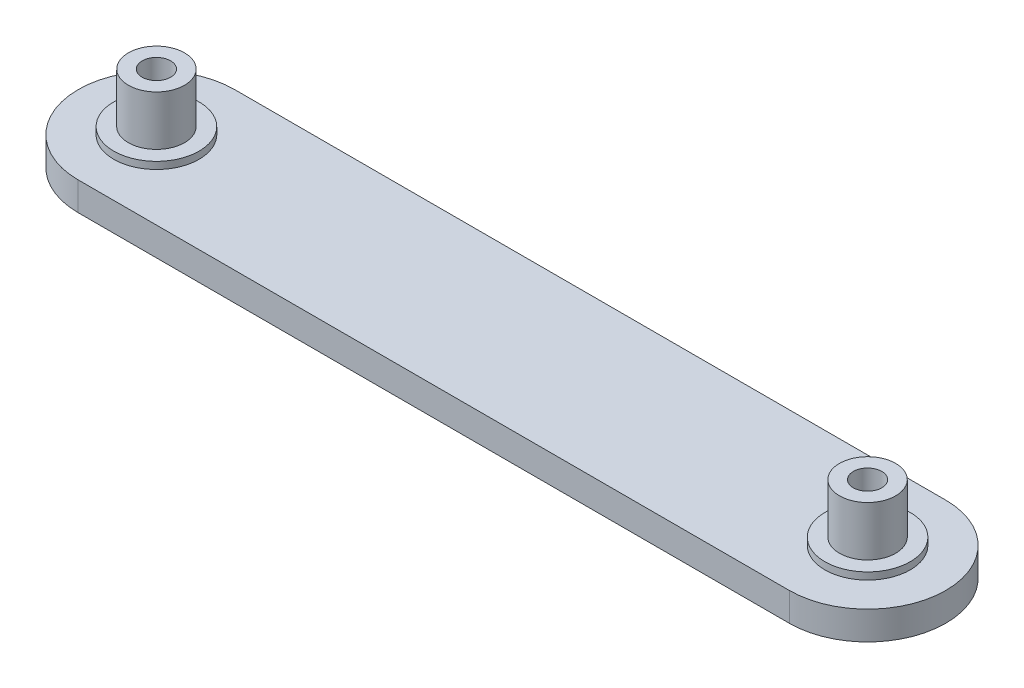
ISO-10303-21;
HEADER;
FILE_DESCRIPTION(('STEP AP214'),'2;1');
FILE_NAME('part.step','',(''),(''),'','','');
FILE_SCHEMA(('AUTOMOTIVE_DESIGN { 1 0 10303 214 1 1 1 1 }'));
ENDSEC;
DATA;
#1=APPLICATION_CONTEXT('core data for automotive mechanical design processes');
#2=APPLICATION_PROTOCOL_DEFINITION('international standard','automotive_design',2000,#1);
#3=PRODUCT_CONTEXT('',#1,'mechanical');
#4=PRODUCT('Part','Part','',(#3));
#5=PRODUCT_RELATED_PRODUCT_CATEGORY('part','',(#4));
#6=PRODUCT_DEFINITION_FORMATION('','',#4);
#7=PRODUCT_DEFINITION_CONTEXT('part definition',#1,'design');
#8=PRODUCT_DEFINITION('design','',#6,#7);
#9=PRODUCT_DEFINITION_SHAPE('','',#8);
#10=(LENGTH_UNIT() NAMED_UNIT(*) SI_UNIT(.MILLI.,.METRE.));
#11=(NAMED_UNIT(*) PLANE_ANGLE_UNIT() SI_UNIT($,.RADIAN.));
#12=(NAMED_UNIT(*) SI_UNIT($,.STERADIAN.) SOLID_ANGLE_UNIT());
#13=UNCERTAINTY_MEASURE_WITH_UNIT(LENGTH_MEASURE(1.E-05),#10,'distance_accuracy_value','');
#14=(GEOMETRIC_REPRESENTATION_CONTEXT(3) GLOBAL_UNCERTAINTY_ASSIGNED_CONTEXT((#13)) GLOBAL_UNIT_ASSIGNED_CONTEXT((#10,
#11,#12)) REPRESENTATION_CONTEXT('',''));
#15=CARTESIAN_POINT('',(0.,0.,0.));
#16=DIRECTION('',(0.,0.,1.));
#17=DIRECTION('',(1.,0.,0.));
#18=AXIS2_PLACEMENT_3D('',#15,#16,#17);
#19=CARTESIAN_POINT('',(0.,4.,0.));
#20=DIRECTION('',(0.,-1.,0.));
#21=DIRECTION('',(0.,0.,-1.));
#22=AXIS2_PLACEMENT_3D('',#19,#20,#21);
#23=CYLINDRICAL_SURFACE('',#22,11.);
#24=CARTESIAN_POINT('',(0.,0.,0.));
#25=DIRECTION('',(0.,1.,0.));
#26=DIRECTION('',(0.,0.,1.));
#27=AXIS2_PLACEMENT_3D('',#24,#25,#26);
#28=CIRCLE('',#27,11.);
#29=CARTESIAN_POINT('',(0.,0.,-11.));
#30=VERTEX_POINT('',#29);
#31=CARTESIAN_POINT('',(0.,0.,11.));
#32=VERTEX_POINT('',#31);
#33=EDGE_CURVE('E100',#30,#32,#28,.T.);
#34=ORIENTED_EDGE('',*,*,#33,.T.);
#35=DIRECTION('',(0.,-1.,0.));
#36=VECTOR('',#35,1.);
#37=CARTESIAN_POINT('',(0.,4.,11.));
#38=LINE('',#37,#36);
#39=CARTESIAN_POINT('',(0.,4.,11.));
#40=VERTEX_POINT('',#39);
#41=EDGE_CURVE('E36',#40,#32,#38,.T.);
#42=ORIENTED_EDGE('',*,*,#41,.F.);
#43=CARTESIAN_POINT('',(0.,4.,0.));
#44=DIRECTION('',(0.,1.,0.));
#45=DIRECTION('',(0.,0.,1.));
#46=AXIS2_PLACEMENT_3D('',#43,#44,#45);
#47=CIRCLE('',#46,11.);
#48=CARTESIAN_POINT('',(0.,4.,-11.));
#49=VERTEX_POINT('',#48);
#50=EDGE_CURVE('E87',#49,#40,#47,.T.);
#51=ORIENTED_EDGE('',*,*,#50,.F.);
#52=DIRECTION('',(0.,-1.,0.));
#53=VECTOR('',#52,1.);
#54=CARTESIAN_POINT('',(0.,4.,-11.));
#55=LINE('',#54,#53);
#56=EDGE_CURVE('E96',#49,#30,#55,.T.);
#57=ORIENTED_EDGE('',*,*,#56,.T.);
#58=EDGE_LOOP('',(#34,#42,#51,#57));
#59=FACE_BOUND('',#58,.T.);
#60=ADVANCED_FACE('F33',(#59),#23,.T.);
#61=CARTESIAN_POINT('',(0.,4.,11.));
#62=DIRECTION('',(0.,0.,-1.));
#63=DIRECTION('',(-1.,0.,0.));
#64=AXIS2_PLACEMENT_3D('',#61,#62,#63);
#65=PLANE('',#64);
#66=DIRECTION('',(1.,0.,0.));
#67=VECTOR('',#66,1.);
#68=CARTESIAN_POINT('',(0.,0.,11.));
#69=LINE('',#68,#67);
#70=CARTESIAN_POINT('',(100.,0.,11.));
#71=VERTEX_POINT('',#70);
#72=EDGE_CURVE('E92',#32,#71,#69,.T.);
#73=ORIENTED_EDGE('',*,*,#72,.T.);
#74=DIRECTION('',(0.,-1.,0.));
#75=VECTOR('',#74,1.);
#76=CARTESIAN_POINT('',(100.,4.,11.));
#77=LINE('',#76,#75);
#78=CARTESIAN_POINT('',(100.,4.,11.));
#79=VERTEX_POINT('',#78);
#80=EDGE_CURVE('E90',#79,#71,#77,.T.);
#81=ORIENTED_EDGE('',*,*,#80,.F.);
#82=DIRECTION('',(1.,0.,0.));
#83=VECTOR('',#82,1.);
#84=CARTESIAN_POINT('',(0.,4.,11.));
#85=LINE('',#84,#83);
#86=EDGE_CURVE('E82',#40,#79,#85,.T.);
#87=ORIENTED_EDGE('',*,*,#86,.F.);
#88=ORIENTED_EDGE('',*,*,#41,.T.);
#89=EDGE_LOOP('',(#73,#81,#87,#88));
#90=FACE_BOUND('',#89,.T.);
#91=ADVANCED_FACE('F91',(#90),#65,.F.);
#92=CARTESIAN_POINT('',(100.,4.,0.));
#93=DIRECTION('',(0.,-1.,0.));
#94=DIRECTION('',(0.,0.,-1.));
#95=AXIS2_PLACEMENT_3D('',#92,#93,#94);
#96=CYLINDRICAL_SURFACE('',#95,11.);
#97=CARTESIAN_POINT('',(100.,0.,0.));
#98=DIRECTION('',(0.,1.,0.));
#99=DIRECTION('',(0.,0.,1.));
#100=AXIS2_PLACEMENT_3D('',#97,#98,#99);
#101=CIRCLE('',#100,11.);
#102=CARTESIAN_POINT('',(100.,0.,-11.));
#103=VERTEX_POINT('',#102);
#104=EDGE_CURVE('E68',#71,#103,#101,.T.);
#105=ORIENTED_EDGE('',*,*,#104,.T.);
#106=DIRECTION('',(0.,-1.,0.));
#107=VECTOR('',#106,1.);
#108=CARTESIAN_POINT('',(100.,4.,-11.));
#109=LINE('',#108,#107);
#110=CARTESIAN_POINT('',(100.,4.,-11.));
#111=VERTEX_POINT('',#110);
#112=EDGE_CURVE('E93',#111,#103,#109,.T.);
#113=ORIENTED_EDGE('',*,*,#112,.F.);
#114=CARTESIAN_POINT('',(100.,4.,0.));
#115=DIRECTION('',(0.,1.,0.));
#116=DIRECTION('',(0.,0.,1.));
#117=AXIS2_PLACEMENT_3D('',#114,#115,#116);
#118=CIRCLE('',#117,11.);
#119=EDGE_CURVE('E85',#79,#111,#118,.T.);
#120=ORIENTED_EDGE('',*,*,#119,.F.);
#121=ORIENTED_EDGE('',*,*,#80,.T.);
#122=EDGE_LOOP('',(#105,#113,#120,#121));
#123=FACE_BOUND('',#122,.T.);
#124=ADVANCED_FACE('F94',(#123),#96,.T.);
#125=CARTESIAN_POINT('',(0.,4.,-11.));
#126=DIRECTION('',(0.,0.,1.));
#127=DIRECTION('',(1.,0.,0.));
#128=AXIS2_PLACEMENT_3D('',#125,#126,#127);
#129=PLANE('',#128);
#130=DIRECTION('',(-1.,0.,0.));
#131=VECTOR('',#130,1.);
#132=CARTESIAN_POINT('',(0.,0.,-11.));
#133=LINE('',#132,#131);
#134=EDGE_CURVE('E74',#103,#30,#133,.T.);
#135=ORIENTED_EDGE('',*,*,#134,.T.);
#136=ORIENTED_EDGE('',*,*,#56,.F.);
#137=DIRECTION('',(-1.,0.,0.));
#138=VECTOR('',#137,1.);
#139=CARTESIAN_POINT('',(0.,4.,-11.));
#140=LINE('',#139,#138);
#141=EDGE_CURVE('E51',#111,#49,#140,.T.);
#142=ORIENTED_EDGE('',*,*,#141,.F.);
#143=ORIENTED_EDGE('',*,*,#112,.T.);
#144=EDGE_LOOP('',(#135,#136,#142,#143));
#145=FACE_BOUND('',#144,.T.);
#146=ADVANCED_FACE('F108',(#145),#129,.F.);
#147=CARTESIAN_POINT('',(0.,4.,0.));
#148=DIRECTION('',(0.,1.,0.));
#149=DIRECTION('',(0.,0.,1.));
#150=AXIS2_PLACEMENT_3D('',#147,#148,#149);
#151=PLANE('',#150);
#152=CARTESIAN_POINT('',(100.,4.,0.));
#153=DIRECTION('',(0.,1.,0.));
#154=DIRECTION('',(0.,0.,1.));
#155=AXIS2_PLACEMENT_3D('',#152,#153,#154);
#156=CIRCLE('',#155,6.);
#157=CARTESIAN_POINT('',(100.,4.,6.));
#158=VERTEX_POINT('',#157);
#159=EDGE_CURVE('E120',#158,#158,#156,.T.);
#160=ORIENTED_EDGE('',*,*,#159,.F.);
#161=EDGE_LOOP('',(#160));
#162=FACE_BOUND('',#161,.T.);
#163=CARTESIAN_POINT('',(0.,4.,0.));
#164=DIRECTION('',(0.,1.,0.));
#165=DIRECTION('',(0.,0.,1.));
#166=AXIS2_PLACEMENT_3D('',#163,#164,#165);
#167=CIRCLE('',#166,6.);
#168=CARTESIAN_POINT('',(0.,4.,6.));
#169=VERTEX_POINT('',#168);
#170=EDGE_CURVE('E114',#169,#169,#167,.T.);
#171=ORIENTED_EDGE('',*,*,#170,.F.);
#172=EDGE_LOOP('',(#171));
#173=FACE_BOUND('',#172,.T.);
#174=ORIENTED_EDGE('',*,*,#50,.T.);
#175=ORIENTED_EDGE('',*,*,#86,.T.);
#176=ORIENTED_EDGE('',*,*,#119,.T.);
#177=ORIENTED_EDGE('',*,*,#141,.T.);
#178=EDGE_LOOP('',(#174,#175,#176,#177));
#179=FACE_BOUND('',#178,.T.);
#180=ADVANCED_FACE('F83',(#162,#173,#179),#151,.T.);
#181=CARTESIAN_POINT('',(0.,0.,0.));
#182=DIRECTION('',(0.,1.,0.));
#183=DIRECTION('',(0.,0.,1.));
#184=AXIS2_PLACEMENT_3D('',#181,#182,#183);
#185=PLANE('',#184);
#186=CARTESIAN_POINT('',(0.,0.,0.));
#187=DIRECTION('',(0.,1.,0.));
#188=DIRECTION('',(0.,0.,1.));
#189=AXIS2_PLACEMENT_3D('',#186,#187,#188);
#190=CIRCLE('',#189,2.);
#191=CARTESIAN_POINT('',(0.,0.,2.));
#192=VERTEX_POINT('',#191);
#193=EDGE_CURVE('E133',#192,#192,#190,.T.);
#194=ORIENTED_EDGE('',*,*,#193,.T.);
#195=EDGE_LOOP('',(#194));
#196=FACE_BOUND('',#195,.T.);
#197=CARTESIAN_POINT('',(100.,0.,0.));
#198=DIRECTION('',(0.,1.,0.));
#199=DIRECTION('',(0.,0.,1.));
#200=AXIS2_PLACEMENT_3D('',#197,#198,#199);
#201=CIRCLE('',#200,2.);
#202=CARTESIAN_POINT('',(100.,0.,2.));
#203=VERTEX_POINT('',#202);
#204=EDGE_CURVE('E137',#203,#203,#201,.T.);
#205=ORIENTED_EDGE('',*,*,#204,.T.);
#206=EDGE_LOOP('',(#205));
#207=FACE_BOUND('',#206,.T.);
#208=ORIENTED_EDGE('',*,*,#33,.F.);
#209=ORIENTED_EDGE('',*,*,#134,.F.);
#210=ORIENTED_EDGE('',*,*,#104,.F.);
#211=ORIENTED_EDGE('',*,*,#72,.F.);
#212=EDGE_LOOP('',(#208,#209,#210,#211));
#213=FACE_BOUND('',#212,.T.);
#214=ADVANCED_FACE('F111',(#196,#207,#213),#185,.F.);
#215=CARTESIAN_POINT('',(0.,5.,0.));
#216=DIRECTION('',(0.,-1.,0.));
#217=DIRECTION('',(0.,0.,-1.));
#218=AXIS2_PLACEMENT_3D('',#215,#216,#217);
#219=CYLINDRICAL_SURFACE('',#218,6.);
#220=CARTESIAN_POINT('',(0.,5.,0.));
#221=DIRECTION('',(0.,1.,0.));
#222=DIRECTION('',(0.,0.,1.));
#223=AXIS2_PLACEMENT_3D('',#220,#221,#222);
#224=CIRCLE('',#223,6.);
#225=CARTESIAN_POINT('',(0.,5.,6.));
#226=VERTEX_POINT('',#225);
#227=EDGE_CURVE('E103',#226,#226,#224,.T.);
#228=ORIENTED_EDGE('',*,*,#227,.F.);
#229=EDGE_LOOP('',(#228));
#230=FACE_BOUND('',#229,.T.);
#231=ORIENTED_EDGE('',*,*,#170,.T.);
#232=EDGE_LOOP('',(#231));
#233=FACE_BOUND('',#232,.T.);
#234=ADVANCED_FACE('F173',(#230,#233),#219,.T.);
#235=CARTESIAN_POINT('',(0.,5.,0.));
#236=DIRECTION('',(0.,1.,0.));
#237=DIRECTION('',(0.,0.,1.));
#238=AXIS2_PLACEMENT_3D('',#235,#236,#237);
#239=PLANE('',#238);
#240=CARTESIAN_POINT('',(0.,5.,0.));
#241=DIRECTION('',(0.,1.,0.));
#242=DIRECTION('',(0.,0.,1.));
#243=AXIS2_PLACEMENT_3D('',#240,#241,#242);
#244=CIRCLE('',#243,3.95);
#245=CARTESIAN_POINT('',(0.,5.,3.95));
#246=VERTEX_POINT('',#245);
#247=EDGE_CURVE('E42',#246,#246,#244,.T.);
#248=ORIENTED_EDGE('',*,*,#247,.F.);
#249=EDGE_LOOP('',(#248));
#250=FACE_BOUND('',#249,.T.);
#251=ORIENTED_EDGE('',*,*,#227,.T.);
#252=EDGE_LOOP('',(#251));
#253=FACE_BOUND('',#252,.T.);
#254=ADVANCED_FACE('F169',(#250,#253),#239,.T.);
#255=CARTESIAN_POINT('',(100.,5.,0.));
#256=DIRECTION('',(0.,-1.,0.));
#257=DIRECTION('',(0.,0.,-1.));
#258=AXIS2_PLACEMENT_3D('',#255,#256,#257);
#259=CYLINDRICAL_SURFACE('',#258,6.);
#260=CARTESIAN_POINT('',(100.,5.,0.));
#261=DIRECTION('',(0.,1.,0.));
#262=DIRECTION('',(0.,0.,1.));
#263=AXIS2_PLACEMENT_3D('',#260,#261,#262);
#264=CIRCLE('',#263,6.);
#265=CARTESIAN_POINT('',(100.,5.,6.));
#266=VERTEX_POINT('',#265);
#267=EDGE_CURVE('E117',#266,#266,#264,.T.);
#268=ORIENTED_EDGE('',*,*,#267,.F.);
#269=EDGE_LOOP('',(#268));
#270=FACE_BOUND('',#269,.T.);
#271=ORIENTED_EDGE('',*,*,#159,.T.);
#272=EDGE_LOOP('',(#271));
#273=FACE_BOUND('',#272,.T.);
#274=ADVANCED_FACE('F172',(#270,#273),#259,.T.);
#275=CARTESIAN_POINT('',(100.,5.,0.));
#276=DIRECTION('',(0.,1.,0.));
#277=DIRECTION('',(0.,0.,1.));
#278=AXIS2_PLACEMENT_3D('',#275,#276,#277);
#279=PLANE('',#278);
#280=CARTESIAN_POINT('',(100.,5.,0.));
#281=DIRECTION('',(0.,1.,0.));
#282=DIRECTION('',(0.,0.,1.));
#283=AXIS2_PLACEMENT_3D('',#280,#281,#282);
#284=CIRCLE('',#283,3.94999999999999);
#285=CARTESIAN_POINT('',(100.,5.,3.94999999999999));
#286=VERTEX_POINT('',#285);
#287=EDGE_CURVE('E11',#286,#286,#284,.T.);
#288=ORIENTED_EDGE('',*,*,#287,.F.);
#289=EDGE_LOOP('',(#288));
#290=FACE_BOUND('',#289,.T.);
#291=ORIENTED_EDGE('',*,*,#267,.T.);
#292=EDGE_LOOP('',(#291));
#293=FACE_BOUND('',#292,.T.);
#294=ADVANCED_FACE('F165',(#290,#293),#279,.T.);
#295=CARTESIAN_POINT('',(0.,12.,0.));
#296=DIRECTION('',(0.,-1.,0.));
#297=DIRECTION('',(0.,0.,-1.));
#298=AXIS2_PLACEMENT_3D('',#295,#296,#297);
#299=CYLINDRICAL_SURFACE('',#298,3.95);
#300=CARTESIAN_POINT('',(0.,12.,0.));
#301=DIRECTION('',(0.,1.,0.));
#302=DIRECTION('',(0.,0.,1.));
#303=AXIS2_PLACEMENT_3D('',#300,#301,#302);
#304=CIRCLE('',#303,3.95);
#305=CARTESIAN_POINT('',(0.,12.,3.95));
#306=VERTEX_POINT('',#305);
#307=EDGE_CURVE('E123',#306,#306,#304,.T.);
#308=ORIENTED_EDGE('',*,*,#307,.F.);
#309=EDGE_LOOP('',(#308));
#310=FACE_BOUND('',#309,.T.);
#311=ORIENTED_EDGE('',*,*,#247,.T.);
#312=EDGE_LOOP('',(#311));
#313=FACE_BOUND('',#312,.T.);
#314=ADVANCED_FACE('F159',(#310,#313),#299,.T.);
#315=CARTESIAN_POINT('',(0.,12.,0.));
#316=DIRECTION('',(0.,1.,0.));
#317=DIRECTION('',(0.,0.,1.));
#318=AXIS2_PLACEMENT_3D('',#315,#316,#317);
#319=PLANE('',#318);
#320=CARTESIAN_POINT('',(0.,12.,0.));
#321=DIRECTION('',(0.,1.,0.));
#322=DIRECTION('',(0.,0.,1.));
#323=AXIS2_PLACEMENT_3D('',#320,#321,#322);
#324=CIRCLE('',#323,2.);
#325=CARTESIAN_POINT('',(0.,12.,2.));
#326=VERTEX_POINT('',#325);
#327=EDGE_CURVE('E140',#326,#326,#324,.T.);
#328=ORIENTED_EDGE('',*,*,#327,.F.);
#329=EDGE_LOOP('',(#328));
#330=FACE_BOUND('',#329,.T.);
#331=ORIENTED_EDGE('',*,*,#307,.T.);
#332=EDGE_LOOP('',(#331));
#333=FACE_BOUND('',#332,.T.);
#334=ADVANCED_FACE('F155',(#330,#333),#319,.T.);
#335=CARTESIAN_POINT('',(100.,12.,0.));
#336=DIRECTION('',(0.,-1.,0.));
#337=DIRECTION('',(0.,0.,-1.));
#338=AXIS2_PLACEMENT_3D('',#335,#336,#337);
#339=CYLINDRICAL_SURFACE('',#338,3.94999999999999);
#340=CARTESIAN_POINT('',(100.,12.,0.));
#341=DIRECTION('',(0.,1.,0.));
#342=DIRECTION('',(0.,0.,1.));
#343=AXIS2_PLACEMENT_3D('',#340,#341,#342);
#344=CIRCLE('',#343,3.94999999999999);
#345=CARTESIAN_POINT('',(100.,12.,3.94999999999999));
#346=VERTEX_POINT('',#345);
#347=EDGE_CURVE('E129',#346,#346,#344,.T.);
#348=ORIENTED_EDGE('',*,*,#347,.F.);
#349=EDGE_LOOP('',(#348));
#350=FACE_BOUND('',#349,.T.);
#351=ORIENTED_EDGE('',*,*,#287,.T.);
#352=EDGE_LOOP('',(#351));
#353=FACE_BOUND('',#352,.T.);
#354=ADVANCED_FACE('F158',(#350,#353),#339,.T.);
#355=CARTESIAN_POINT('',(100.,12.,0.));
#356=DIRECTION('',(0.,1.,0.));
#357=DIRECTION('',(0.,0.,1.));
#358=AXIS2_PLACEMENT_3D('',#355,#356,#357);
#359=PLANE('',#358);
#360=CARTESIAN_POINT('',(100.,12.,0.));
#361=DIRECTION('',(0.,1.,0.));
#362=DIRECTION('',(0.,0.,1.));
#363=AXIS2_PLACEMENT_3D('',#360,#361,#362);
#364=CIRCLE('',#363,2.);
#365=CARTESIAN_POINT('',(100.,12.,2.));
#366=VERTEX_POINT('',#365);
#367=EDGE_CURVE('E134',#366,#366,#364,.T.);
#368=ORIENTED_EDGE('',*,*,#367,.F.);
#369=EDGE_LOOP('',(#368));
#370=FACE_BOUND('',#369,.T.);
#371=ORIENTED_EDGE('',*,*,#347,.T.);
#372=EDGE_LOOP('',(#371));
#373=FACE_BOUND('',#372,.T.);
#374=ADVANCED_FACE('F257',(#370,#373),#359,.T.);
#375=CARTESIAN_POINT('',(100.,0.,0.));
#376=DIRECTION('',(0.,1.,0.));
#377=DIRECTION('',(0.,0.,1.));
#378=AXIS2_PLACEMENT_3D('',#375,#376,#377);
#379=CYLINDRICAL_SURFACE('',#378,2.);
#380=ORIENTED_EDGE('',*,*,#204,.F.);
#381=EDGE_LOOP('',(#380));
#382=FACE_BOUND('',#381,.T.);
#383=ORIENTED_EDGE('',*,*,#367,.T.);
#384=EDGE_LOOP('',(#383));
#385=FACE_BOUND('',#384,.T.);
#386=ADVANCED_FACE('F151',(#382,#385),#379,.F.);
#387=CARTESIAN_POINT('',(0.,0.,0.));
#388=DIRECTION('',(0.,1.,0.));
#389=DIRECTION('',(0.,0.,1.));
#390=AXIS2_PLACEMENT_3D('',#387,#388,#389);
#391=CYLINDRICAL_SURFACE('',#390,2.);
#392=ORIENTED_EDGE('',*,*,#193,.F.);
#393=EDGE_LOOP('',(#392));
#394=FACE_BOUND('',#393,.T.);
#395=ORIENTED_EDGE('',*,*,#327,.T.);
#396=EDGE_LOOP('',(#395));
#397=FACE_BOUND('',#396,.T.);
#398=ADVANCED_FACE('F148',(#394,#397),#391,.F.);
#399=CLOSED_SHELL('',(#60,#91,#124,#146,#180,#214,#234,#254,#274,#294,#314,#334,#354,#374,#386,#398));
#400=MANIFOLD_SOLID_BREP('B2',#399);
#401=ADVANCED_BREP_SHAPE_REPRESENTATION('',(#18,#400),#14);
#402=SHAPE_DEFINITION_REPRESENTATION(#9,#401);
ENDSEC;
END-ISO-10303-21;
